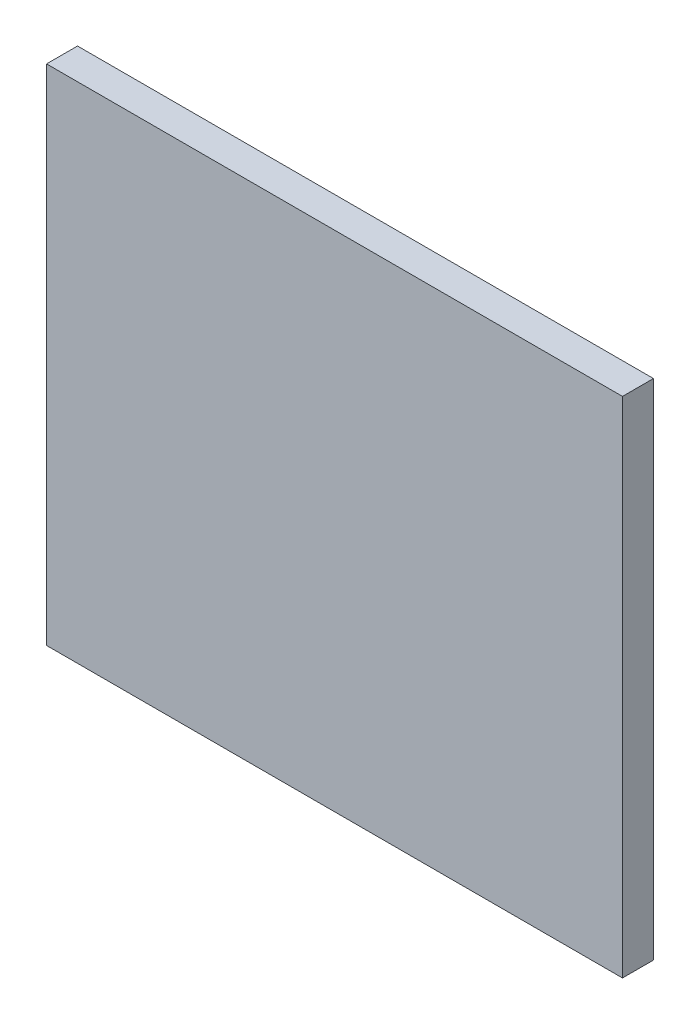
ISO-10303-21;
HEADER;
FILE_DESCRIPTION(('STEP AP214'),'2;1');
FILE_NAME('part.step','',(''),(''),'','','');
FILE_SCHEMA(('AUTOMOTIVE_DESIGN { 1 0 10303 214 1 1 1 1 }'));
ENDSEC;
DATA;
#1=APPLICATION_CONTEXT('core data for automotive mechanical design processes');
#2=APPLICATION_PROTOCOL_DEFINITION('international standard','automotive_design',2000,#1);
#3=PRODUCT_CONTEXT('',#1,'mechanical');
#4=PRODUCT('Part','Part','',(#3));
#5=PRODUCT_RELATED_PRODUCT_CATEGORY('part','',(#4));
#6=PRODUCT_DEFINITION_FORMATION('','',#4);
#7=PRODUCT_DEFINITION_CONTEXT('part definition',#1,'design');
#8=PRODUCT_DEFINITION('design','',#6,#7);
#9=PRODUCT_DEFINITION_SHAPE('','',#8);
#10=(LENGTH_UNIT() NAMED_UNIT(*) SI_UNIT(.MILLI.,.METRE.));
#11=(NAMED_UNIT(*) PLANE_ANGLE_UNIT() SI_UNIT($,.RADIAN.));
#12=(NAMED_UNIT(*) SI_UNIT($,.STERADIAN.) SOLID_ANGLE_UNIT());
#13=UNCERTAINTY_MEASURE_WITH_UNIT(LENGTH_MEASURE(1.E-05),#10,'distance_accuracy_value','');
#14=(GEOMETRIC_REPRESENTATION_CONTEXT(3) GLOBAL_UNCERTAINTY_ASSIGNED_CONTEXT((#13)) GLOBAL_UNIT_ASSIGNED_CONTEXT((#10,
#11,#12)) REPRESENTATION_CONTEXT('',''));
#15=CARTESIAN_POINT('',(0.,0.,0.));
#16=DIRECTION('',(0.,0.,1.));
#17=DIRECTION('',(1.,0.,0.));
#18=AXIS2_PLACEMENT_3D('',#15,#16,#17);
#19=CARTESIAN_POINT('',(0.,0.,15.));
#20=DIRECTION('',(0.,1.,0.));
#21=DIRECTION('',(0.,0.,1.));
#22=AXIS2_PLACEMENT_3D('',#19,#20,#21);
#23=PLANE('',#22);
#24=DIRECTION('',(1.,0.,0.));
#25=VECTOR('',#24,1.);
#26=CARTESIAN_POINT('',(0.,0.,0.));
#27=LINE('',#26,#25);
#28=CARTESIAN_POINT('',(-279.,0.,0.));
#29=VERTEX_POINT('',#28);
#30=CARTESIAN_POINT('',(0.,0.,0.));
#31=VERTEX_POINT('',#30);
#32=EDGE_CURVE('E113',#29,#31,#27,.T.);
#33=ORIENTED_EDGE('',*,*,#32,.T.);
#34=DIRECTION('',(0.,0.,-1.));
#35=VECTOR('',#34,1.);
#36=CARTESIAN_POINT('',(0.,0.,15.));
#37=LINE('',#36,#35);
#38=CARTESIAN_POINT('',(0.,0.,15.));
#39=VERTEX_POINT('',#38);
#40=EDGE_CURVE('E11',#39,#31,#37,.T.);
#41=ORIENTED_EDGE('',*,*,#40,.F.);
#42=DIRECTION('',(1.,0.,0.));
#43=VECTOR('',#42,1.);
#44=CARTESIAN_POINT('',(0.,0.,15.));
#45=LINE('',#44,#43);
#46=CARTESIAN_POINT('',(-279.,0.,15.));
#47=VERTEX_POINT('',#46);
#48=EDGE_CURVE('E97',#47,#39,#45,.T.);
#49=ORIENTED_EDGE('',*,*,#48,.F.);
#50=DIRECTION('',(0.,0.,-1.));
#51=VECTOR('',#50,1.);
#52=CARTESIAN_POINT('',(-279.,0.,15.));
#53=LINE('',#52,#51);
#54=EDGE_CURVE('E109',#47,#29,#53,.T.);
#55=ORIENTED_EDGE('',*,*,#54,.T.);
#56=EDGE_LOOP('',(#33,#41,#49,#55));
#57=FACE_BOUND('',#56,.T.);
#58=ADVANCED_FACE('F45',(#57),#23,.F.);
#59=CARTESIAN_POINT('',(0.,0.,15.));
#60=DIRECTION('',(-1.,0.,0.));
#61=DIRECTION('',(0.,0.,1.));
#62=AXIS2_PLACEMENT_3D('',#59,#60,#61);
#63=PLANE('',#62);
#64=DIRECTION('',(0.,1.,0.));
#65=VECTOR('',#64,1.);
#66=CARTESIAN_POINT('',(0.,0.,0.));
#67=LINE('',#66,#65);
#68=CARTESIAN_POINT('',(0.,244.,0.));
#69=VERTEX_POINT('',#68);
#70=EDGE_CURVE('E102',#31,#69,#67,.T.);
#71=ORIENTED_EDGE('',*,*,#70,.T.);
#72=DIRECTION('',(0.,0.,-1.));
#73=VECTOR('',#72,1.);
#74=CARTESIAN_POINT('',(0.,244.,15.));
#75=LINE('',#74,#73);
#76=CARTESIAN_POINT('',(0.,244.,15.));
#77=VERTEX_POINT('',#76);
#78=EDGE_CURVE('E54',#77,#69,#75,.T.);
#79=ORIENTED_EDGE('',*,*,#78,.F.);
#80=DIRECTION('',(0.,1.,0.));
#81=VECTOR('',#80,1.);
#82=CARTESIAN_POINT('',(0.,0.,15.));
#83=LINE('',#82,#81);
#84=EDGE_CURVE('E92',#39,#77,#83,.T.);
#85=ORIENTED_EDGE('',*,*,#84,.F.);
#86=ORIENTED_EDGE('',*,*,#40,.T.);
#87=EDGE_LOOP('',(#71,#79,#85,#86));
#88=FACE_BOUND('',#87,.T.);
#89=ADVANCED_FACE('F101',(#88),#63,.F.);
#90=CARTESIAN_POINT('',(0.,244.,15.));
#91=DIRECTION('',(0.,-1.,0.));
#92=DIRECTION('',(0.,0.,-1.));
#93=AXIS2_PLACEMENT_3D('',#90,#91,#92);
#94=PLANE('',#93);
#95=DIRECTION('',(-1.,0.,0.));
#96=VECTOR('',#95,1.);
#97=CARTESIAN_POINT('',(0.,244.,0.));
#98=LINE('',#97,#96);
#99=CARTESIAN_POINT('',(-279.,244.,0.));
#100=VERTEX_POINT('',#99);
#101=EDGE_CURVE('E79',#69,#100,#98,.T.);
#102=ORIENTED_EDGE('',*,*,#101,.T.);
#103=DIRECTION('',(0.,0.,-1.));
#104=VECTOR('',#103,1.);
#105=CARTESIAN_POINT('',(-279.,244.,15.));
#106=LINE('',#105,#104);
#107=CARTESIAN_POINT('',(-279.,244.,15.));
#108=VERTEX_POINT('',#107);
#109=EDGE_CURVE('E104',#108,#100,#106,.T.);
#110=ORIENTED_EDGE('',*,*,#109,.F.);
#111=DIRECTION('',(-1.,0.,0.));
#112=VECTOR('',#111,1.);
#113=CARTESIAN_POINT('',(0.,244.,15.));
#114=LINE('',#113,#112);
#115=EDGE_CURVE('E95',#77,#108,#114,.T.);
#116=ORIENTED_EDGE('',*,*,#115,.F.);
#117=ORIENTED_EDGE('',*,*,#78,.T.);
#118=EDGE_LOOP('',(#102,#110,#116,#117));
#119=FACE_BOUND('',#118,.T.);
#120=ADVANCED_FACE('F105',(#119),#94,.F.);
#121=CARTESIAN_POINT('',(-279.,0.,15.));
#122=DIRECTION('',(1.,0.,0.));
#123=DIRECTION('',(0.,0.,-1.));
#124=AXIS2_PLACEMENT_3D('',#121,#122,#123);
#125=PLANE('',#124);
#126=DIRECTION('',(0.,-1.,0.));
#127=VECTOR('',#126,1.);
#128=CARTESIAN_POINT('',(-279.,0.,0.));
#129=LINE('',#128,#127);
#130=EDGE_CURVE('E85',#100,#29,#129,.T.);
#131=ORIENTED_EDGE('',*,*,#130,.T.);
#132=ORIENTED_EDGE('',*,*,#54,.F.);
#133=DIRECTION('',(0.,-1.,0.));
#134=VECTOR('',#133,1.);
#135=CARTESIAN_POINT('',(-279.,0.,15.));
#136=LINE('',#135,#134);
#137=EDGE_CURVE('E62',#108,#47,#136,.T.);
#138=ORIENTED_EDGE('',*,*,#137,.F.);
#139=ORIENTED_EDGE('',*,*,#109,.T.);
#140=EDGE_LOOP('',(#131,#132,#138,#139));
#141=FACE_BOUND('',#140,.T.);
#142=ADVANCED_FACE('F126',(#141),#125,.F.);
#143=CARTESIAN_POINT('',(0.,0.,15.));
#144=DIRECTION('',(0.,0.,-1.));
#145=DIRECTION('',(-1.,0.,0.));
#146=AXIS2_PLACEMENT_3D('',#143,#144,#145);
#147=PLANE('',#146);
#148=ORIENTED_EDGE('',*,*,#48,.T.);
#149=ORIENTED_EDGE('',*,*,#84,.T.);
#150=ORIENTED_EDGE('',*,*,#115,.T.);
#151=ORIENTED_EDGE('',*,*,#137,.T.);
#152=EDGE_LOOP('',(#148,#149,#150,#151));
#153=FACE_BOUND('',#152,.T.);
#154=ADVANCED_FACE('F93',(#153),#147,.F.);
#155=CARTESIAN_POINT('',(0.,0.,0.));
#156=DIRECTION('',(0.,0.,-1.));
#157=DIRECTION('',(-1.,0.,0.));
#158=AXIS2_PLACEMENT_3D('',#155,#156,#157);
#159=PLANE('',#158);
#160=ORIENTED_EDGE('',*,*,#32,.F.);
#161=ORIENTED_EDGE('',*,*,#130,.F.);
#162=ORIENTED_EDGE('',*,*,#101,.F.);
#163=ORIENTED_EDGE('',*,*,#70,.F.);
#164=EDGE_LOOP('',(#160,#161,#162,#163));
#165=FACE_BOUND('',#164,.T.);
#166=ADVANCED_FACE('F129',(#165),#159,.T.);
#167=CLOSED_SHELL('',(#58,#89,#120,#142,#154,#166));
#168=MANIFOLD_SOLID_BREP('B2',#167);
#169=ADVANCED_BREP_SHAPE_REPRESENTATION('',(#18,#168),#14);
#170=SHAPE_DEFINITION_REPRESENTATION(#9,#169);
ENDSEC;
END-ISO-10303-21;
